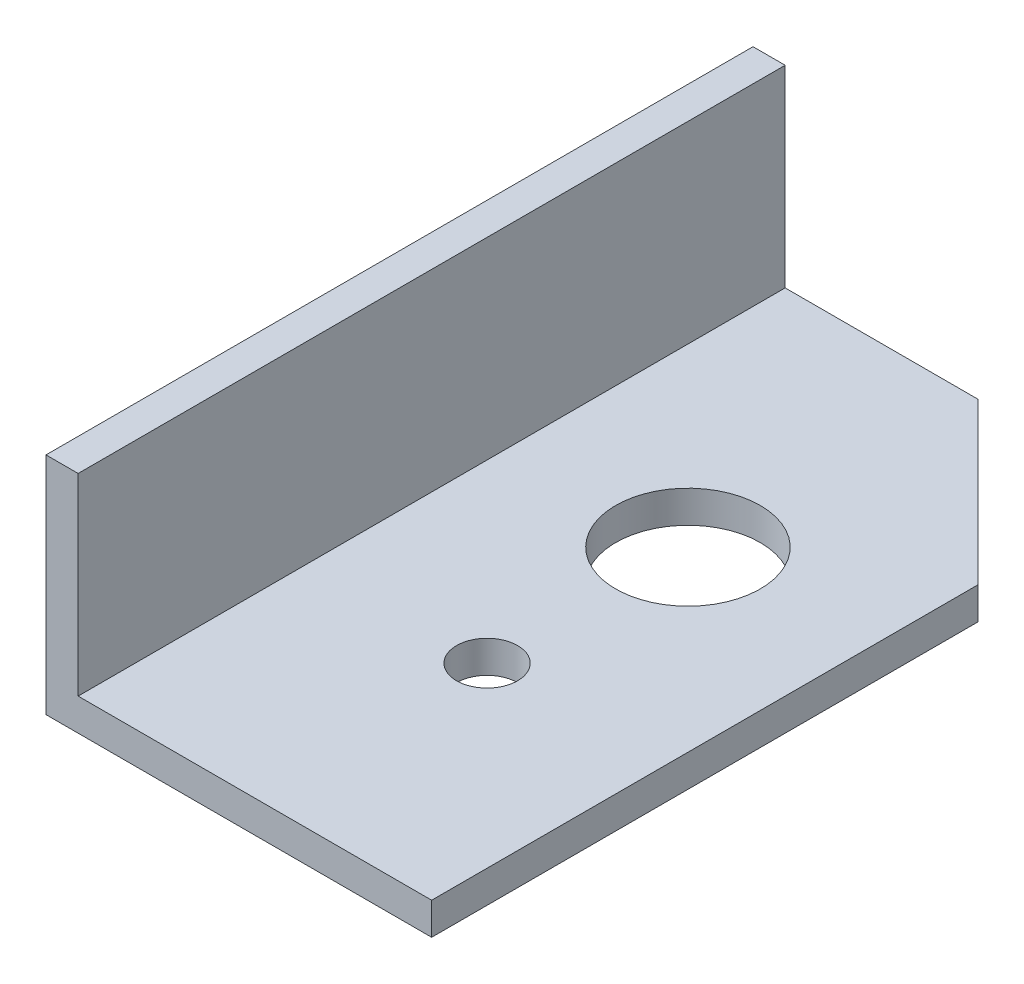
ISO-10303-21;
HEADER;
FILE_DESCRIPTION(('STEP AP214'),'2;1');
FILE_NAME('part.step','',(''),(''),'','','');
FILE_SCHEMA(('AUTOMOTIVE_DESIGN { 1 0 10303 214 1 1 1 1 }'));
ENDSEC;
DATA;
#1=APPLICATION_CONTEXT('core data for automotive mechanical design processes');
#2=APPLICATION_PROTOCOL_DEFINITION('international standard','automotive_design',2000,#1);
#3=PRODUCT_CONTEXT('',#1,'mechanical');
#4=PRODUCT('Part','Part','',(#3));
#5=PRODUCT_RELATED_PRODUCT_CATEGORY('part','',(#4));
#6=PRODUCT_DEFINITION_FORMATION('','',#4);
#7=PRODUCT_DEFINITION_CONTEXT('part definition',#1,'design');
#8=PRODUCT_DEFINITION('design','',#6,#7);
#9=PRODUCT_DEFINITION_SHAPE('','',#8);
#10=(LENGTH_UNIT() NAMED_UNIT(*) SI_UNIT(.MILLI.,.METRE.));
#11=(NAMED_UNIT(*) PLANE_ANGLE_UNIT() SI_UNIT($,.RADIAN.));
#12=(NAMED_UNIT(*) SI_UNIT($,.STERADIAN.) SOLID_ANGLE_UNIT());
#13=UNCERTAINTY_MEASURE_WITH_UNIT(LENGTH_MEASURE(1.E-05),#10,'distance_accuracy_value','');
#14=(GEOMETRIC_REPRESENTATION_CONTEXT(3) GLOBAL_UNCERTAINTY_ASSIGNED_CONTEXT((#13)) GLOBAL_UNIT_ASSIGNED_CONTEXT((#10,
#11,#12)) REPRESENTATION_CONTEXT('',''));
#15=CARTESIAN_POINT('',(0.,0.,0.));
#16=DIRECTION('',(0.,0.,1.));
#17=DIRECTION('',(1.,0.,0.));
#18=AXIS2_PLACEMENT_3D('',#15,#16,#17);
#19=CARTESIAN_POINT('',(0.,0.,44.));
#20=DIRECTION('',(0.,1.,0.));
#21=DIRECTION('',(0.,0.,1.));
#22=AXIS2_PLACEMENT_3D('',#19,#20,#21);
#23=PLANE('',#22);
#24=CARTESIAN_POINT('',(12.9500000000016,0.,29.5000000000002));
#25=DIRECTION('',(0.,1.,0.));
#26=DIRECTION('',(0.,0.,-1.));
#27=AXIS2_PLACEMENT_3D('',#24,#25,#26);
#28=CIRCLE('',#27,1.9000000000011);
#29=CARTESIAN_POINT('',(12.9500000000016,0.,27.5999999999991));
#30=VERTEX_POINT('',#29);
#31=EDGE_CURVE('E198',#30,#30,#28,.T.);
#32=ORIENTED_EDGE('',*,*,#31,.T.);
#33=EDGE_LOOP('',(#32));
#34=FACE_BOUND('',#33,.T.);
#35=CARTESIAN_POINT('',(12.9500000000016,0.,17.0000000000002));
#36=DIRECTION('',(0.,1.,0.));
#37=DIRECTION('',(0.,0.,-1.));
#38=AXIS2_PLACEMENT_3D('',#35,#36,#37);
#39=CIRCLE('',#38,4.5000000000011);
#40=CARTESIAN_POINT('',(12.9500000000016,0.,12.4999999999991));
#41=VERTEX_POINT('',#40);
#42=EDGE_CURVE('E123',#41,#41,#39,.T.);
#43=ORIENTED_EDGE('',*,*,#42,.T.);
#44=EDGE_LOOP('',(#43));
#45=FACE_BOUND('',#44,.T.);
#46=DIRECTION('',(1.,0.,0.));
#47=VECTOR('',#46,1.);
#48=CARTESIAN_POINT('',(0.,0.,0.));
#49=LINE('',#48,#47);
#50=CARTESIAN_POINT('',(0.,0.,0.));
#51=VERTEX_POINT('',#50);
#52=CARTESIAN_POINT('',(14.,0.,0.));
#53=VERTEX_POINT('',#52);
#54=EDGE_CURVE('E120',#51,#53,#49,.T.);
#55=ORIENTED_EDGE('',*,*,#54,.T.);
#56=DIRECTION('',(-0.707106781186546,0.,-0.707106781186549));
#57=VECTOR('',#56,1.);
#58=CARTESIAN_POINT('',(14.,0.,0.));
#59=LINE('',#58,#57);
#60=CARTESIAN_POINT('',(24.,0.,10.));
#61=VERTEX_POINT('',#60);
#62=EDGE_CURVE('E53',#53,#61,#59,.F.);
#63=ORIENTED_EDGE('',*,*,#62,.T.);
#64=DIRECTION('',(0.,0.,-1.));
#65=VECTOR('',#64,1.);
#66=CARTESIAN_POINT('',(24.,0.,44.));
#67=LINE('',#66,#65);
#68=CARTESIAN_POINT('',(24.,0.,44.));
#69=VERTEX_POINT('',#68);
#70=EDGE_CURVE('E102',#69,#61,#67,.T.);
#71=ORIENTED_EDGE('',*,*,#70,.F.);
#72=DIRECTION('',(1.,0.,0.));
#73=VECTOR('',#72,1.);
#74=CARTESIAN_POINT('',(0.,0.,44.));
#75=LINE('',#74,#73);
#76=CARTESIAN_POINT('',(0.,0.,44.));
#77=VERTEX_POINT('',#76);
#78=EDGE_CURVE('E89',#77,#69,#75,.T.);
#79=ORIENTED_EDGE('',*,*,#78,.F.);
#80=DIRECTION('',(0.,0.,-1.));
#81=VECTOR('',#80,1.);
#82=CARTESIAN_POINT('',(0.,0.,44.));
#83=LINE('',#82,#81);
#84=EDGE_CURVE('E119',#77,#51,#83,.T.);
#85=ORIENTED_EDGE('',*,*,#84,.T.);
#86=EDGE_LOOP('',(#55,#63,#71,#79,#85));
#87=FACE_BOUND('',#86,.T.);
#88=ADVANCED_FACE('F31',(#34,#45,#87),#23,.F.);
#89=CARTESIAN_POINT('',(24.,2.,44.));
#90=DIRECTION('',(1.,0.,0.));
#91=DIRECTION('',(0.,0.,-1.));
#92=AXIS2_PLACEMENT_3D('',#89,#90,#91);
#93=PLANE('',#92);
#94=ORIENTED_EDGE('',*,*,#70,.T.);
#95=DIRECTION('',(0.,1.,0.));
#96=VECTOR('',#95,1.);
#97=CARTESIAN_POINT('',(24.,2.,10.));
#98=LINE('',#97,#96);
#99=CARTESIAN_POINT('',(24.,2.,10.));
#100=VERTEX_POINT('',#99);
#101=EDGE_CURVE('E39',#61,#100,#98,.T.);
#102=ORIENTED_EDGE('',*,*,#101,.T.);
#103=DIRECTION('',(0.,0.,-1.));
#104=VECTOR('',#103,1.);
#105=CARTESIAN_POINT('',(24.,2.,44.));
#106=LINE('',#105,#104);
#107=CARTESIAN_POINT('',(24.,2.,44.));
#108=VERTEX_POINT('',#107);
#109=EDGE_CURVE('E104',#108,#100,#106,.T.);
#110=ORIENTED_EDGE('',*,*,#109,.F.);
#111=DIRECTION('',(0.,-1.,0.));
#112=VECTOR('',#111,1.);
#113=CARTESIAN_POINT('',(24.,2.,44.));
#114=LINE('',#113,#112);
#115=EDGE_CURVE('E93',#108,#69,#114,.T.);
#116=ORIENTED_EDGE('',*,*,#115,.T.);
#117=EDGE_LOOP('',(#94,#102,#110,#116));
#118=FACE_BOUND('',#117,.T.);
#119=ADVANCED_FACE('F106',(#118),#93,.T.);
#120=CARTESIAN_POINT('',(0.,2.,44.));
#121=DIRECTION('',(0.,1.,0.));
#122=DIRECTION('',(0.,0.,1.));
#123=AXIS2_PLACEMENT_3D('',#120,#121,#122);
#124=PLANE('',#123);
#125=CARTESIAN_POINT('',(12.9500000000016,2.,29.5000000000002));
#126=DIRECTION('',(0.,1.,0.));
#127=DIRECTION('',(0.,0.,-1.));
#128=AXIS2_PLACEMENT_3D('',#125,#126,#127);
#129=CIRCLE('',#128,1.9000000000011);
#130=CARTESIAN_POINT('',(12.9500000000016,2.,27.5999999999991));
#131=VERTEX_POINT('',#130);
#132=EDGE_CURVE('E201',#131,#131,#129,.T.);
#133=ORIENTED_EDGE('',*,*,#132,.F.);
#134=EDGE_LOOP('',(#133));
#135=FACE_BOUND('',#134,.T.);
#136=CARTESIAN_POINT('',(12.9500000000016,2.,17.0000000000002));
#137=DIRECTION('',(0.,1.,0.));
#138=DIRECTION('',(0.,0.,-1.));
#139=AXIS2_PLACEMENT_3D('',#136,#137,#138);
#140=CIRCLE('',#139,4.5000000000011);
#141=CARTESIAN_POINT('',(12.9500000000016,2.,12.4999999999991));
#142=VERTEX_POINT('',#141);
#143=EDGE_CURVE('E203',#142,#142,#140,.T.);
#144=ORIENTED_EDGE('',*,*,#143,.F.);
#145=EDGE_LOOP('',(#144));
#146=FACE_BOUND('',#145,.T.);
#147=ORIENTED_EDGE('',*,*,#109,.T.);
#148=DIRECTION('',(0.707106781186546,0.,0.707106781186549));
#149=VECTOR('',#148,1.);
#150=CARTESIAN_POINT('',(29.,2.,15.0000000000001));
#151=LINE('',#150,#149);
#152=CARTESIAN_POINT('',(14.,2.,0.));
#153=VERTEX_POINT('',#152);
#154=EDGE_CURVE('E11',#100,#153,#151,.F.);
#155=ORIENTED_EDGE('',*,*,#154,.T.);
#156=DIRECTION('',(1.,0.,0.));
#157=VECTOR('',#156,1.);
#158=CARTESIAN_POINT('',(0.,2.,0.));
#159=LINE('',#158,#157);
#160=CARTESIAN_POINT('',(2.,2.,0.));
#161=VERTEX_POINT('',#160);
#162=EDGE_CURVE('E122',#161,#153,#159,.T.);
#163=ORIENTED_EDGE('',*,*,#162,.F.);
#164=DIRECTION('',(0.,0.,-1.));
#165=VECTOR('',#164,1.);
#166=CARTESIAN_POINT('',(2.,2.,44.));
#167=LINE('',#166,#165);
#168=CARTESIAN_POINT('',(2.,2.,44.));
#169=VERTEX_POINT('',#168);
#170=EDGE_CURVE('E138',#169,#161,#167,.T.);
#171=ORIENTED_EDGE('',*,*,#170,.F.);
#172=DIRECTION('',(1.,0.,0.));
#173=VECTOR('',#172,1.);
#174=CARTESIAN_POINT('',(0.,2.,44.));
#175=LINE('',#174,#173);
#176=EDGE_CURVE('E107',#169,#108,#175,.T.);
#177=ORIENTED_EDGE('',*,*,#176,.T.);
#178=EDGE_LOOP('',(#147,#155,#163,#171,#177));
#179=FACE_BOUND('',#178,.T.);
#180=ADVANCED_FACE('F161',(#135,#146,#179),#124,.T.);
#181=CARTESIAN_POINT('',(2.,0.,44.));
#182=DIRECTION('',(1.,0.,0.));
#183=DIRECTION('',(0.,0.,-1.));
#184=AXIS2_PLACEMENT_3D('',#181,#182,#183);
#185=PLANE('',#184);
#186=DIRECTION('',(0.,1.,0.));
#187=VECTOR('',#186,1.);
#188=CARTESIAN_POINT('',(2.,0.,0.));
#189=LINE('',#188,#187);
#190=CARTESIAN_POINT('',(2.,14.,0.));
#191=VERTEX_POINT('',#190);
#192=EDGE_CURVE('E126',#191,#161,#189,.F.);
#193=ORIENTED_EDGE('',*,*,#192,.F.);
#194=DIRECTION('',(0.,0.,-1.));
#195=VECTOR('',#194,1.);
#196=CARTESIAN_POINT('',(2.,14.,44.));
#197=LINE('',#196,#195);
#198=CARTESIAN_POINT('',(2.,14.,44.));
#199=VERTEX_POINT('',#198);
#200=EDGE_CURVE('E136',#199,#191,#197,.T.);
#201=ORIENTED_EDGE('',*,*,#200,.F.);
#202=DIRECTION('',(0.,1.,0.));
#203=VECTOR('',#202,1.);
#204=CARTESIAN_POINT('',(2.,0.,44.));
#205=LINE('',#204,#203);
#206=EDGE_CURVE('E109',#199,#169,#205,.F.);
#207=ORIENTED_EDGE('',*,*,#206,.T.);
#208=ORIENTED_EDGE('',*,*,#170,.T.);
#209=EDGE_LOOP('',(#193,#201,#207,#208));
#210=FACE_BOUND('',#209,.T.);
#211=ADVANCED_FACE('F159',(#210),#185,.T.);
#212=CARTESIAN_POINT('',(0.,14.,44.));
#213=DIRECTION('',(0.,1.,0.));
#214=DIRECTION('',(0.,0.,1.));
#215=AXIS2_PLACEMENT_3D('',#212,#213,#214);
#216=PLANE('',#215);
#217=DIRECTION('',(1.,0.,0.));
#218=VECTOR('',#217,1.);
#219=CARTESIAN_POINT('',(0.,14.,0.));
#220=LINE('',#219,#218);
#221=CARTESIAN_POINT('',(0.,14.,0.));
#222=VERTEX_POINT('',#221);
#223=EDGE_CURVE('E129',#222,#191,#220,.T.);
#224=ORIENTED_EDGE('',*,*,#223,.F.);
#225=DIRECTION('',(0.,0.,-1.));
#226=VECTOR('',#225,1.);
#227=CARTESIAN_POINT('',(0.,14.,44.));
#228=LINE('',#227,#226);
#229=CARTESIAN_POINT('',(0.,14.,44.));
#230=VERTEX_POINT('',#229);
#231=EDGE_CURVE('E134',#230,#222,#228,.T.);
#232=ORIENTED_EDGE('',*,*,#231,.F.);
#233=DIRECTION('',(1.,0.,0.));
#234=VECTOR('',#233,1.);
#235=CARTESIAN_POINT('',(0.,14.,44.));
#236=LINE('',#235,#234);
#237=EDGE_CURVE('E115',#230,#199,#236,.T.);
#238=ORIENTED_EDGE('',*,*,#237,.T.);
#239=ORIENTED_EDGE('',*,*,#200,.T.);
#240=EDGE_LOOP('',(#224,#232,#238,#239));
#241=FACE_BOUND('',#240,.T.);
#242=ADVANCED_FACE('F155',(#241),#216,.T.);
#243=CARTESIAN_POINT('',(0.,0.,44.));
#244=DIRECTION('',(1.,0.,0.));
#245=DIRECTION('',(0.,0.,-1.));
#246=AXIS2_PLACEMENT_3D('',#243,#244,#245);
#247=PLANE('',#246);
#248=DIRECTION('',(0.,-1.,0.));
#249=VECTOR('',#248,1.);
#250=CARTESIAN_POINT('',(0.,0.,0.));
#251=LINE('',#250,#249);
#252=EDGE_CURVE('E100',#222,#51,#251,.T.);
#253=ORIENTED_EDGE('',*,*,#252,.T.);
#254=ORIENTED_EDGE('',*,*,#84,.F.);
#255=DIRECTION('',(0.,-1.,0.));
#256=VECTOR('',#255,1.);
#257=CARTESIAN_POINT('',(0.,0.,44.));
#258=LINE('',#257,#256);
#259=EDGE_CURVE('E97',#230,#77,#258,.T.);
#260=ORIENTED_EDGE('',*,*,#259,.F.);
#261=ORIENTED_EDGE('',*,*,#231,.T.);
#262=EDGE_LOOP('',(#253,#254,#260,#261));
#263=FACE_BOUND('',#262,.T.);
#264=ADVANCED_FACE('F152',(#263),#247,.F.);
#265=CARTESIAN_POINT('',(24.,0.,44.));
#266=DIRECTION('',(0.,0.,-1.));
#267=DIRECTION('',(-1.,0.,0.));
#268=AXIS2_PLACEMENT_3D('',#265,#266,#267);
#269=PLANE('',#268);
#270=ORIENTED_EDGE('',*,*,#78,.T.);
#271=ORIENTED_EDGE('',*,*,#115,.F.);
#272=ORIENTED_EDGE('',*,*,#176,.F.);
#273=ORIENTED_EDGE('',*,*,#206,.F.);
#274=ORIENTED_EDGE('',*,*,#237,.F.);
#275=ORIENTED_EDGE('',*,*,#259,.T.);
#276=EDGE_LOOP('',(#270,#271,#272,#273,#274,#275));
#277=FACE_BOUND('',#276,.T.);
#278=ADVANCED_FACE('F90',(#277),#269,.F.);
#279=CARTESIAN_POINT('',(24.,0.,0.));
#280=DIRECTION('',(0.,0.,-1.));
#281=DIRECTION('',(-1.,0.,0.));
#282=AXIS2_PLACEMENT_3D('',#279,#280,#281);
#283=PLANE('',#282);
#284=ORIENTED_EDGE('',*,*,#162,.T.);
#285=DIRECTION('',(0.,-1.,0.));
#286=VECTOR('',#285,1.);
#287=CARTESIAN_POINT('',(14.,0.,0.));
#288=LINE('',#287,#286);
#289=EDGE_CURVE('E103',#153,#53,#288,.T.);
#290=ORIENTED_EDGE('',*,*,#289,.T.);
#291=ORIENTED_EDGE('',*,*,#54,.F.);
#292=ORIENTED_EDGE('',*,*,#252,.F.);
#293=ORIENTED_EDGE('',*,*,#223,.T.);
#294=ORIENTED_EDGE('',*,*,#192,.T.);
#295=EDGE_LOOP('',(#284,#290,#291,#292,#293,#294));
#296=FACE_BOUND('',#295,.T.);
#297=ADVANCED_FACE('F146',(#296),#283,.T.);
#298=CARTESIAN_POINT('',(14.,0.,0.));
#299=DIRECTION('',(-0.707106781186549,0.,0.707106781186546));
#300=DIRECTION('',(0.707106781186546,0.,0.707106781186549));
#301=AXIS2_PLACEMENT_3D('',#298,#299,#300);
#302=PLANE('',#301);
#303=ORIENTED_EDGE('',*,*,#154,.F.);
#304=ORIENTED_EDGE('',*,*,#101,.F.);
#305=ORIENTED_EDGE('',*,*,#62,.F.);
#306=ORIENTED_EDGE('',*,*,#289,.F.);
#307=EDGE_LOOP('',(#303,#304,#305,#306));
#308=FACE_BOUND('',#307,.T.);
#309=ADVANCED_FACE('F33',(#308),#302,.F.);
#310=CARTESIAN_POINT('',(12.9500000000016,0.,17.0000000000002));
#311=DIRECTION('',(0.,1.,0.));
#312=DIRECTION('',(0.,0.,1.));
#313=AXIS2_PLACEMENT_3D('',#310,#311,#312);
#314=CYLINDRICAL_SURFACE('',#313,4.5000000000011);
#315=ORIENTED_EDGE('',*,*,#42,.F.);
#316=EDGE_LOOP('',(#315));
#317=FACE_BOUND('',#316,.T.);
#318=ORIENTED_EDGE('',*,*,#143,.T.);
#319=EDGE_LOOP('',(#318));
#320=FACE_BOUND('',#319,.T.);
#321=ADVANCED_FACE('F163',(#317,#320),#314,.F.);
#322=CARTESIAN_POINT('',(12.9500000000016,0.,29.5000000000002));
#323=DIRECTION('',(0.,1.,0.));
#324=DIRECTION('',(0.,0.,1.));
#325=AXIS2_PLACEMENT_3D('',#322,#323,#324);
#326=CYLINDRICAL_SURFACE('',#325,1.9000000000011);
#327=ORIENTED_EDGE('',*,*,#31,.F.);
#328=EDGE_LOOP('',(#327));
#329=FACE_BOUND('',#328,.T.);
#330=ORIENTED_EDGE('',*,*,#132,.T.);
#331=EDGE_LOOP('',(#330));
#332=FACE_BOUND('',#331,.T.);
#333=ADVANCED_FACE('F168',(#329,#332),#326,.F.);
#334=CLOSED_SHELL('',(#88,#119,#180,#211,#242,#264,#278,#297,#309,#321,#333));
#335=MANIFOLD_SOLID_BREP('B2',#334);
#336=ADVANCED_BREP_SHAPE_REPRESENTATION('',(#18,#335),#14);
#337=SHAPE_DEFINITION_REPRESENTATION(#9,#336);
ENDSEC;
END-ISO-10303-21;
